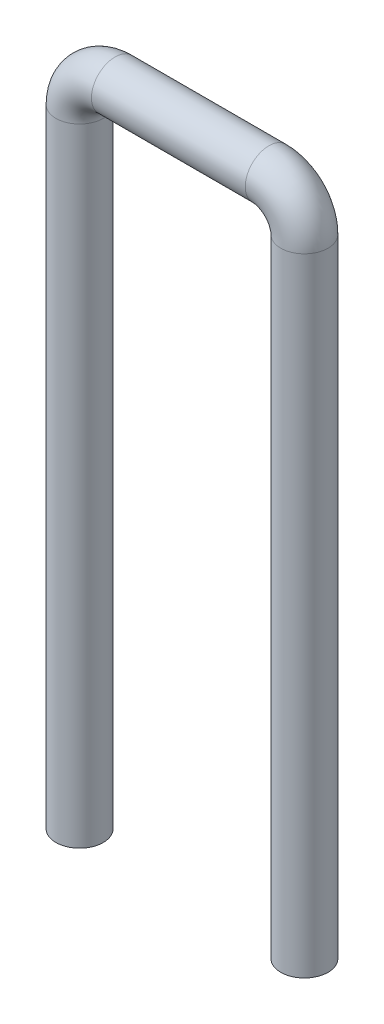
ISO-10303-21;
HEADER;
FILE_DESCRIPTION(('STEP AP214'),'2;1');
FILE_NAME('part.step','',(''),(''),'','','');
FILE_SCHEMA(('AUTOMOTIVE_DESIGN { 1 0 10303 214 1 1 1 1 }'));
ENDSEC;
DATA;
#1=APPLICATION_CONTEXT('core data for automotive mechanical design processes');
#2=APPLICATION_PROTOCOL_DEFINITION('international standard','automotive_design',2000,#1);
#3=PRODUCT_CONTEXT('',#1,'mechanical');
#4=PRODUCT('Part','Part','',(#3));
#5=PRODUCT_RELATED_PRODUCT_CATEGORY('part','',(#4));
#6=PRODUCT_DEFINITION_FORMATION('','',#4);
#7=PRODUCT_DEFINITION_CONTEXT('part definition',#1,'design');
#8=PRODUCT_DEFINITION('design','',#6,#7);
#9=PRODUCT_DEFINITION_SHAPE('','',#8);
#10=(LENGTH_UNIT() NAMED_UNIT(*) SI_UNIT(.MILLI.,.METRE.));
#11=(NAMED_UNIT(*) PLANE_ANGLE_UNIT() SI_UNIT($,.RADIAN.));
#12=(NAMED_UNIT(*) SI_UNIT($,.STERADIAN.) SOLID_ANGLE_UNIT());
#13=UNCERTAINTY_MEASURE_WITH_UNIT(LENGTH_MEASURE(1.E-05),#10,'distance_accuracy_value','');
#14=(GEOMETRIC_REPRESENTATION_CONTEXT(3) GLOBAL_UNCERTAINTY_ASSIGNED_CONTEXT((#13)) GLOBAL_UNIT_ASSIGNED_CONTEXT((#10,
#11,#12)) REPRESENTATION_CONTEXT('',''));
#15=CARTESIAN_POINT('',(0.,0.,0.));
#16=DIRECTION('',(0.,0.,1.));
#17=DIRECTION('',(1.,0.,0.));
#18=AXIS2_PLACEMENT_3D('',#15,#16,#17);
#19=CARTESIAN_POINT('',(19.,53.,0.));
#20=DIRECTION('',(0.,-1.,0.));
#21=DIRECTION('',(1.,0.,0.));
#22=AXIS2_PLACEMENT_3D('',#19,#20,#21);
#23=CYLINDRICAL_SURFACE('',#22,2.);
#24=CARTESIAN_POINT('',(19.,53.,0.));
#25=DIRECTION('',(0.,-1.,0.));
#26=DIRECTION('',(0.,0.,1.));
#27=AXIS2_PLACEMENT_3D('',#24,#25,#26);
#28=CIRCLE('',#27,2.);
#29=CARTESIAN_POINT('',(21.,53.,0.));
#30=VERTEX_POINT('',#29);
#31=EDGE_CURVE('E37',#30,#30,#28,.T.);
#32=ORIENTED_EDGE('',*,*,#31,.T.);
#33=EDGE_LOOP('',(#32));
#34=FACE_BOUND('',#33,.T.);
#35=CARTESIAN_POINT('',(19.,0.,0.));
#36=DIRECTION('',(0.,-1.,0.));
#37=DIRECTION('',(0.,0.,1.));
#38=AXIS2_PLACEMENT_3D('',#35,#36,#37);
#39=CIRCLE('',#38,2.);
#40=CARTESIAN_POINT('',(19.,0.,2.));
#41=VERTEX_POINT('',#40);
#42=EDGE_CURVE('E10',#41,#41,#39,.T.);
#43=ORIENTED_EDGE('',*,*,#42,.F.);
#44=EDGE_LOOP('',(#43));
#45=FACE_BOUND('',#44,.T.);
#46=ADVANCED_FACE('F31',(#34,#45),#23,.T.);
#47=CARTESIAN_POINT('',(16.,53.,0.));
#48=DIRECTION('',(0.,0.,-1.));
#49=DIRECTION('',(-1.,0.,0.));
#50=AXIS2_PLACEMENT_3D('',#47,#48,#49);
#51=TOROIDAL_SURFACE('',#50,3.00000000000001,2.);
#52=CARTESIAN_POINT('',(16.,56.,0.));
#53=DIRECTION('',(1.,0.,0.));
#54=DIRECTION('',(0.,0.,1.));
#55=AXIS2_PLACEMENT_3D('',#52,#53,#54);
#56=CIRCLE('',#55,2.);
#57=CARTESIAN_POINT('',(16.,58.,0.));
#58=VERTEX_POINT('',#57);
#59=EDGE_CURVE('E41',#58,#58,#56,.T.);
#60=CARTESIAN_POINT('',(16.,53.,0.));
#61=DIRECTION('',(0.,0.,-1.));
#62=DIRECTION('',(-1.,0.,0.));
#63=AXIS2_PLACEMENT_3D('',#60,#61,#62);
#64=CIRCLE('',#63,5.00000000000001);
#65=EDGE_CURVE('',#58,#30,#64,.T.);
#66=ORIENTED_EDGE('',*,*,#59,.T.);
#67=ORIENTED_EDGE('',*,*,#31,.F.);
#68=ORIENTED_EDGE('',*,*,#65,.T.);
#69=ORIENTED_EDGE('',*,*,#65,.F.);
#70=EDGE_LOOP('',(#66,#68,#67,#69));
#71=FACE_BOUND('',#70,.T.);
#72=ADVANCED_FACE('F75',(#71),#51,.T.);
#73=CARTESIAN_POINT('',(3.00000000000002,56.,0.));
#74=DIRECTION('',(1.,0.,0.));
#75=DIRECTION('',(0.,0.,-1.));
#76=AXIS2_PLACEMENT_3D('',#73,#74,#75);
#77=CYLINDRICAL_SURFACE('',#76,2.);
#78=CARTESIAN_POINT('',(3.00000000000002,56.,0.));
#79=DIRECTION('',(1.,0.,0.));
#80=DIRECTION('',(0.,0.,1.));
#81=AXIS2_PLACEMENT_3D('',#78,#79,#80);
#82=CIRCLE('',#81,2.);
#83=CARTESIAN_POINT('',(3.00000000000004,58.,0.));
#84=VERTEX_POINT('',#83);
#85=EDGE_CURVE('E45',#84,#84,#82,.T.);
#86=ORIENTED_EDGE('',*,*,#85,.T.);
#87=EDGE_LOOP('',(#86));
#88=FACE_BOUND('',#87,.T.);
#89=ORIENTED_EDGE('',*,*,#59,.F.);
#90=EDGE_LOOP('',(#89));
#91=FACE_BOUND('',#90,.T.);
#92=ADVANCED_FACE('F79',(#88,#91),#77,.T.);
#93=CARTESIAN_POINT('',(3.,53.,0.));
#94=DIRECTION('',(0.,0.,-1.));
#95=DIRECTION('',(-1.,0.,0.));
#96=AXIS2_PLACEMENT_3D('',#93,#94,#95);
#97=TOROIDAL_SURFACE('',#96,3.,2.);
#98=CARTESIAN_POINT('',(0.,53.,0.));
#99=DIRECTION('',(0.,1.,0.));
#100=DIRECTION('',(0.,0.,1.));
#101=AXIS2_PLACEMENT_3D('',#98,#99,#100);
#102=CIRCLE('',#101,2.);
#103=CARTESIAN_POINT('',(-2.,53.,0.));
#104=VERTEX_POINT('',#103);
#105=EDGE_CURVE('E50',#104,#104,#102,.T.);
#106=CARTESIAN_POINT('',(3.,53.,0.));
#107=DIRECTION('',(0.,0.,-1.));
#108=DIRECTION('',(-1.,0.,0.));
#109=AXIS2_PLACEMENT_3D('',#106,#107,#108);
#110=CIRCLE('',#109,5.);
#111=EDGE_CURVE('',#104,#84,#110,.T.);
#112=ORIENTED_EDGE('',*,*,#105,.T.);
#113=ORIENTED_EDGE('',*,*,#85,.F.);
#114=ORIENTED_EDGE('',*,*,#111,.T.);
#115=ORIENTED_EDGE('',*,*,#111,.F.);
#116=EDGE_LOOP('',(#112,#114,#113,#115));
#117=FACE_BOUND('',#116,.T.);
#118=ADVANCED_FACE('F57',(#117),#97,.T.);
#119=CARTESIAN_POINT('',(0.,53.,0.));
#120=DIRECTION('',(0.,-1.,0.));
#121=DIRECTION('',(0.,0.,-1.));
#122=AXIS2_PLACEMENT_3D('',#119,#120,#121);
#123=CYLINDRICAL_SURFACE('',#122,2.);
#124=ORIENTED_EDGE('',*,*,#105,.F.);
#125=EDGE_LOOP('',(#124));
#126=FACE_BOUND('',#125,.T.);
#127=CARTESIAN_POINT('',(0.,0.,0.));
#128=DIRECTION('',(0.,1.,0.));
#129=DIRECTION('',(0.,0.,1.));
#130=AXIS2_PLACEMENT_3D('',#127,#128,#129);
#131=CIRCLE('',#130,2.);
#132=CARTESIAN_POINT('',(0.,0.,2.));
#133=VERTEX_POINT('',#132);
#134=EDGE_CURVE('E51',#133,#133,#131,.T.);
#135=ORIENTED_EDGE('',*,*,#134,.T.);
#136=EDGE_LOOP('',(#135));
#137=FACE_BOUND('',#136,.T.);
#138=ADVANCED_FACE('F60',(#126,#137),#123,.T.);
#139=CARTESIAN_POINT('',(19.,0.,0.));
#140=DIRECTION('',(0.,-1.,0.));
#141=DIRECTION('',(0.,0.,1.));
#142=AXIS2_PLACEMENT_3D('',#139,#140,#141);
#143=PLANE('',#142);
#144=ORIENTED_EDGE('',*,*,#42,.T.);
#145=EDGE_LOOP('',(#144));
#146=FACE_BOUND('',#145,.T.);
#147=ADVANCED_FACE('F63',(#146),#143,.T.);
#148=CARTESIAN_POINT('',(0.,0.,0.));
#149=DIRECTION('',(0.,1.,0.));
#150=DIRECTION('',(0.,0.,1.));
#151=AXIS2_PLACEMENT_3D('',#148,#149,#150);
#152=PLANE('',#151);
#153=ORIENTED_EDGE('',*,*,#134,.F.);
#154=EDGE_LOOP('',(#153));
#155=FACE_BOUND('',#154,.T.);
#156=ADVANCED_FACE('F67',(#155),#152,.F.);
#157=CLOSED_SHELL('',(#46,#72,#92,#118,#138,#147,#156));
#158=MANIFOLD_SOLID_BREP('B2',#157);
#159=ADVANCED_BREP_SHAPE_REPRESENTATION('',(#18,#158),#14);
#160=SHAPE_DEFINITION_REPRESENTATION(#9,#159);
ENDSEC;
END-ISO-10303-21;
